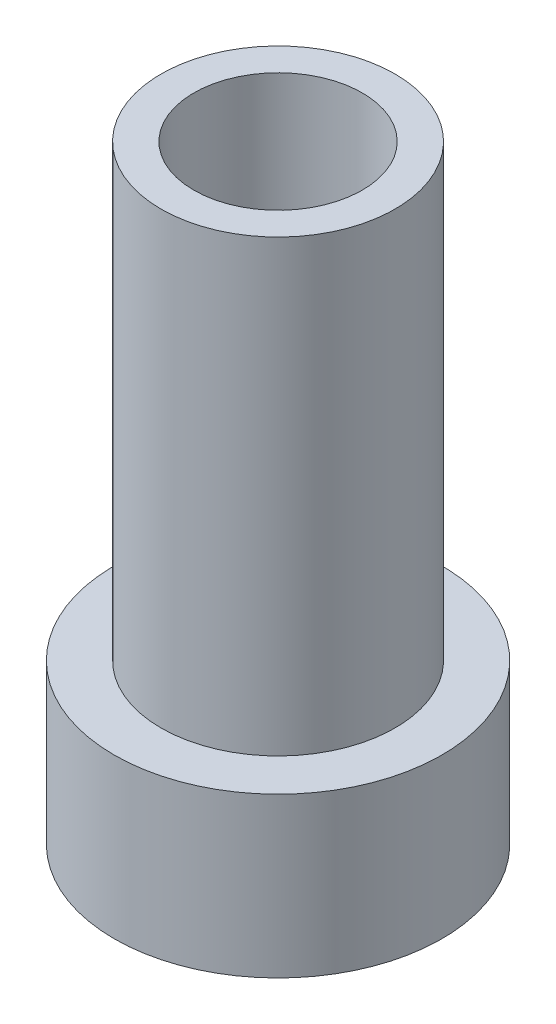
ISO-10303-21;
HEADER;
FILE_DESCRIPTION(('STEP AP214'),'2;1');
FILE_NAME('part.step','',(''),(''),'','','');
FILE_SCHEMA(('AUTOMOTIVE_DESIGN { 1 0 10303 214 1 1 1 1 }'));
ENDSEC;
DATA;
#1=APPLICATION_CONTEXT('core data for automotive mechanical design processes');
#2=APPLICATION_PROTOCOL_DEFINITION('international standard','automotive_design',2000,#1);
#3=PRODUCT_CONTEXT('',#1,'mechanical');
#4=PRODUCT('Part','Part','',(#3));
#5=PRODUCT_RELATED_PRODUCT_CATEGORY('part','',(#4));
#6=PRODUCT_DEFINITION_FORMATION('','',#4);
#7=PRODUCT_DEFINITION_CONTEXT('part definition',#1,'design');
#8=PRODUCT_DEFINITION('design','',#6,#7);
#9=PRODUCT_DEFINITION_SHAPE('','',#8);
#10=(LENGTH_UNIT() NAMED_UNIT(*) SI_UNIT(.MILLI.,.METRE.));
#11=(NAMED_UNIT(*) PLANE_ANGLE_UNIT() SI_UNIT($,.RADIAN.));
#12=(NAMED_UNIT(*) SI_UNIT($,.STERADIAN.) SOLID_ANGLE_UNIT());
#13=UNCERTAINTY_MEASURE_WITH_UNIT(LENGTH_MEASURE(1.E-05),#10,'distance_accuracy_value','');
#14=(GEOMETRIC_REPRESENTATION_CONTEXT(3) GLOBAL_UNCERTAINTY_ASSIGNED_CONTEXT((#13)) GLOBAL_UNIT_ASSIGNED_CONTEXT((#10,
#11,#12)) REPRESENTATION_CONTEXT('',''));
#15=CARTESIAN_POINT('',(0.,0.,0.));
#16=DIRECTION('',(0.,0.,1.));
#17=DIRECTION('',(1.,0.,0.));
#18=AXIS2_PLACEMENT_3D('',#15,#16,#17);
#19=CARTESIAN_POINT('',(0.,50.0001,0.));
#20=DIRECTION('',(0.,-1.,0.));
#21=DIRECTION('',(0.,0.,-1.));
#22=AXIS2_PLACEMENT_3D('',#19,#20,#21);
#23=CYLINDRICAL_SURFACE('',#22,12.5);
#24=CARTESIAN_POINT('',(0.,50.0001,0.));
#25=DIRECTION('',(0.,1.,0.));
#26=DIRECTION('',(0.,0.,1.));
#27=AXIS2_PLACEMENT_3D('',#24,#25,#26);
#28=CIRCLE('',#27,12.5);
#29=CARTESIAN_POINT('',(0.,50.0001,12.5));
#30=VERTEX_POINT('',#29);
#31=EDGE_CURVE('E13',#30,#30,#28,.T.);
#32=ORIENTED_EDGE('',*,*,#31,.F.);
#33=EDGE_LOOP('',(#32));
#34=FACE_BOUND('',#33,.T.);
#35=CARTESIAN_POINT('',(0.,2.0001,0.));
#36=DIRECTION('',(0.,1.,0.));
#37=DIRECTION('',(0.,0.,1.));
#38=AXIS2_PLACEMENT_3D('',#35,#36,#37);
#39=CIRCLE('',#38,12.5);
#40=CARTESIAN_POINT('',(0.,2.0001,12.5));
#41=VERTEX_POINT('',#40);
#42=EDGE_CURVE('E67',#41,#41,#39,.T.);
#43=ORIENTED_EDGE('',*,*,#42,.T.);
#44=EDGE_LOOP('',(#43));
#45=FACE_BOUND('',#44,.T.);
#46=ADVANCED_FACE('F64',(#34,#45),#23,.T.);
#47=CARTESIAN_POINT('',(0.,50.0001,0.));
#48=DIRECTION('',(0.,1.,0.));
#49=DIRECTION('',(0.,0.,1.));
#50=AXIS2_PLACEMENT_3D('',#47,#48,#49);
#51=PLANE('',#50);
#52=CARTESIAN_POINT('',(0.,50.0001,0.));
#53=DIRECTION('',(0.,1.,0.));
#54=DIRECTION('',(0.,0.,1.));
#55=AXIS2_PLACEMENT_3D('',#52,#53,#54);
#56=CIRCLE('',#55,9.);
#57=CARTESIAN_POINT('',(0.,50.0001,9.));
#58=VERTEX_POINT('',#57);
#59=EDGE_CURVE('E76',#58,#58,#56,.T.);
#60=ORIENTED_EDGE('',*,*,#59,.F.);
#61=EDGE_LOOP('',(#60));
#62=FACE_BOUND('',#61,.T.);
#63=ORIENTED_EDGE('',*,*,#31,.T.);
#64=EDGE_LOOP('',(#63));
#65=FACE_BOUND('',#64,.T.);
#66=ADVANCED_FACE('F89',(#62,#65),#51,.T.);
#67=CARTESIAN_POINT('',(0.,2.0001,0.));
#68=DIRECTION('',(0.,1.,0.));
#69=DIRECTION('',(0.,0.,1.));
#70=AXIS2_PLACEMENT_3D('',#67,#68,#69);
#71=PLANE('',#70);
#72=CARTESIAN_POINT('',(0.,2.0001,0.));
#73=DIRECTION('',(0.,1.,0.));
#74=DIRECTION('',(0.,0.,1.));
#75=AXIS2_PLACEMENT_3D('',#72,#73,#74);
#76=CIRCLE('',#75,9.);
#77=CARTESIAN_POINT('',(0.,2.0001,9.));
#78=VERTEX_POINT('',#77);
#79=EDGE_CURVE('E78',#78,#78,#76,.T.);
#80=ORIENTED_EDGE('',*,*,#79,.T.);
#81=EDGE_LOOP('',(#80));
#82=FACE_BOUND('',#81,.T.);
#83=ORIENTED_EDGE('',*,*,#42,.F.);
#84=EDGE_LOOP('',(#83));
#85=FACE_BOUND('',#84,.T.);
#86=ADVANCED_FACE('F91',(#82,#85),#71,.F.);
#87=CARTESIAN_POINT('',(0.,50.0001,0.));
#88=DIRECTION('',(0.,-1.,0.));
#89=DIRECTION('',(0.,0.,-1.));
#90=AXIS2_PLACEMENT_3D('',#87,#88,#89);
#91=CYLINDRICAL_SURFACE('',#90,9.);
#92=ORIENTED_EDGE('',*,*,#59,.T.);
#93=EDGE_LOOP('',(#92));
#94=FACE_BOUND('',#93,.T.);
#95=ORIENTED_EDGE('',*,*,#79,.F.);
#96=EDGE_LOOP('',(#95));
#97=FACE_BOUND('',#96,.T.);
#98=ADVANCED_FACE('F86',(#94,#97),#91,.F.);
#99=CLOSED_SHELL('',(#46,#66,#86,#98));
#100=MANIFOLD_SOLID_BREP('B2',#99);
#101=CARTESIAN_POINT('',(0.,2.0001,0.));
#102=DIRECTION('',(0.,-1.,0.));
#103=DIRECTION('',(0.,0.,-1.));
#104=AXIS2_PLACEMENT_3D('',#101,#102,#103);
#105=CYLINDRICAL_SURFACE('',#104,12.5);
#106=CARTESIAN_POINT('',(0.,-15.,0.));
#107=DIRECTION('',(0.,1.,0.));
#108=DIRECTION('',(0.,0.,1.));
#109=AXIS2_PLACEMENT_3D('',#106,#107,#108);
#110=CIRCLE('',#109,12.5);
#111=CARTESIAN_POINT('',(0.,-15.,12.5));
#112=VERTEX_POINT('',#111);
#113=EDGE_CURVE('E157',#112,#112,#110,.T.);
#114=ORIENTED_EDGE('',*,*,#113,.F.);
#115=EDGE_LOOP('',(#114));
#116=FACE_BOUND('',#115,.T.);
#117=CARTESIAN_POINT('',(0.,0.,0.));
#118=DIRECTION('',(0.,1.,0.));
#119=DIRECTION('',(0.,0.,1.));
#120=AXIS2_PLACEMENT_3D('',#117,#118,#119);
#121=CIRCLE('',#120,12.5);
#122=CARTESIAN_POINT('',(0.,0.,12.5));
#123=VERTEX_POINT('',#122);
#124=EDGE_CURVE('E151',#123,#123,#121,.T.);
#125=ORIENTED_EDGE('',*,*,#124,.T.);
#126=EDGE_LOOP('',(#125));
#127=FACE_BOUND('',#126,.T.);
#128=ADVANCED_FACE('F135',(#116,#127),#105,.F.);
#129=CARTESIAN_POINT('',(0.,2.0001,0.));
#130=DIRECTION('',(0.,1.,0.));
#131=DIRECTION('',(0.,0.,1.));
#132=AXIS2_PLACEMENT_3D('',#129,#130,#131);
#133=PLANE('',#132);
#134=CARTESIAN_POINT('',(0.,2.0001,0.));
#135=DIRECTION('',(0.,1.,0.));
#136=DIRECTION('',(0.,0.,1.));
#137=AXIS2_PLACEMENT_3D('',#134,#135,#136);
#138=CIRCLE('',#137,17.5);
#139=CARTESIAN_POINT('',(0.,2.0001,17.5));
#140=VERTEX_POINT('',#139);
#141=EDGE_CURVE('E63',#140,#140,#138,.T.);
#142=ORIENTED_EDGE('',*,*,#141,.T.);
#143=EDGE_LOOP('',(#142));
#144=FACE_BOUND('',#143,.T.);
#145=CARTESIAN_POINT('',(0.,2.0001,0.));
#146=DIRECTION('',(0.,1.,0.));
#147=DIRECTION('',(0.,0.,1.));
#148=AXIS2_PLACEMENT_3D('',#145,#146,#147);
#149=CIRCLE('',#148,12.5);
#150=CARTESIAN_POINT('',(0.,2.0001,12.5));
#151=VERTEX_POINT('',#150);
#152=EDGE_CURVE('E143',#151,#151,#149,.T.);
#153=ORIENTED_EDGE('',*,*,#152,.F.);
#154=EDGE_LOOP('',(#153));
#155=FACE_BOUND('',#154,.T.);
#156=ADVANCED_FACE('F187',(#144,#155),#133,.T.);
#157=CARTESIAN_POINT('',(0.,2.0001,0.));
#158=DIRECTION('',(0.,-1.,0.));
#159=DIRECTION('',(0.,0.,-1.));
#160=AXIS2_PLACEMENT_3D('',#157,#158,#159);
#161=CYLINDRICAL_SURFACE('',#160,17.5);
#162=ORIENTED_EDGE('',*,*,#141,.F.);
#163=EDGE_LOOP('',(#162));
#164=FACE_BOUND('',#163,.T.);
#165=CARTESIAN_POINT('',(0.,-15.,0.));
#166=DIRECTION('',(0.,1.,0.));
#167=DIRECTION('',(0.,0.,1.));
#168=AXIS2_PLACEMENT_3D('',#165,#166,#167);
#169=CIRCLE('',#168,17.5);
#170=CARTESIAN_POINT('',(0.,-15.,17.5));
#171=VERTEX_POINT('',#170);
#172=EDGE_CURVE('E148',#171,#171,#169,.T.);
#173=ORIENTED_EDGE('',*,*,#172,.T.);
#174=EDGE_LOOP('',(#173));
#175=FACE_BOUND('',#174,.T.);
#176=ADVANCED_FACE('F137',(#164,#175),#161,.T.);
#177=CARTESIAN_POINT('',(0.,2.,0.));
#178=DIRECTION('',(0.,1.,0.));
#179=DIRECTION('',(0.,0.,1.));
#180=AXIS2_PLACEMENT_3D('',#177,#178,#179);
#181=CIRCLE('',#180,12.5);
#182=CARTESIAN_POINT('',(0.,2.,12.5));
#183=VERTEX_POINT('',#182);
#184=EDGE_CURVE('E139',#183,#183,#181,.T.);
#185=ORIENTED_EDGE('',*,*,#184,.F.);
#186=EDGE_LOOP('',(#185));
#187=FACE_BOUND('',#186,.T.);
#188=ORIENTED_EDGE('',*,*,#152,.T.);
#189=EDGE_LOOP('',(#188));
#190=FACE_BOUND('',#189,.T.);
#191=ADVANCED_FACE('F174',(#187,#190),#105,.F.);
#192=CARTESIAN_POINT('',(0.,-15.,0.));
#193=DIRECTION('',(0.,1.,0.));
#194=DIRECTION('',(0.,0.,1.));
#195=AXIS2_PLACEMENT_3D('',#192,#193,#194);
#196=PLANE('',#195);
#197=ORIENTED_EDGE('',*,*,#113,.T.);
#198=EDGE_LOOP('',(#197));
#199=FACE_BOUND('',#198,.T.);
#200=ORIENTED_EDGE('',*,*,#172,.F.);
#201=EDGE_LOOP('',(#200));
#202=FACE_BOUND('',#201,.T.);
#203=ADVANCED_FACE('F171',(#199,#202),#196,.F.);
#204=CARTESIAN_POINT('',(0.,2.,0.));
#205=DIRECTION('',(0.,-1.,0.));
#206=DIRECTION('',(0.,0.,-1.));
#207=AXIS2_PLACEMENT_3D('',#204,#205,#206);
#208=CYLINDRICAL_SURFACE('',#207,15.);
#209=CARTESIAN_POINT('',(0.,2.,0.));
#210=DIRECTION('',(0.,1.,0.));
#211=DIRECTION('',(0.,0.,1.));
#212=AXIS2_PLACEMENT_3D('',#209,#210,#211);
#213=CIRCLE('',#212,15.);
#214=CARTESIAN_POINT('',(0.,2.,15.));
#215=VERTEX_POINT('',#214);
#216=EDGE_CURVE('E153',#215,#215,#213,.T.);
#217=ORIENTED_EDGE('',*,*,#216,.T.);
#218=EDGE_LOOP('',(#217));
#219=FACE_BOUND('',#218,.T.);
#220=CARTESIAN_POINT('',(0.,0.,0.));
#221=DIRECTION('',(0.,1.,0.));
#222=DIRECTION('',(0.,0.,1.));
#223=AXIS2_PLACEMENT_3D('',#220,#221,#222);
#224=CIRCLE('',#223,15.);
#225=CARTESIAN_POINT('',(0.,0.,15.));
#226=VERTEX_POINT('',#225);
#227=EDGE_CURVE('E159',#226,#226,#224,.T.);
#228=ORIENTED_EDGE('',*,*,#227,.F.);
#229=EDGE_LOOP('',(#228));
#230=FACE_BOUND('',#229,.T.);
#231=ADVANCED_FACE('F173',(#219,#230),#208,.F.);
#232=CARTESIAN_POINT('',(0.,2.,0.));
#233=DIRECTION('',(0.,1.,0.));
#234=DIRECTION('',(0.,0.,1.));
#235=AXIS2_PLACEMENT_3D('',#232,#233,#234);
#236=PLANE('',#235);
#237=ORIENTED_EDGE('',*,*,#184,.T.);
#238=EDGE_LOOP('',(#237));
#239=FACE_BOUND('',#238,.T.);
#240=ORIENTED_EDGE('',*,*,#216,.F.);
#241=EDGE_LOOP('',(#240));
#242=FACE_BOUND('',#241,.T.);
#243=ADVANCED_FACE('F182',(#239,#242),#236,.F.);
#244=CARTESIAN_POINT('',(0.,0.,0.));
#245=DIRECTION('',(0.,1.,0.));
#246=DIRECTION('',(0.,0.,1.));
#247=AXIS2_PLACEMENT_3D('',#244,#245,#246);
#248=PLANE('',#247);
#249=ORIENTED_EDGE('',*,*,#124,.F.);
#250=EDGE_LOOP('',(#249));
#251=FACE_BOUND('',#250,.T.);
#252=ORIENTED_EDGE('',*,*,#227,.T.);
#253=EDGE_LOOP('',(#252));
#254=FACE_BOUND('',#253,.T.);
#255=ADVANCED_FACE('F234',(#251,#254),#248,.T.);
#256=CLOSED_SHELL('',(#128,#156,#176,#191,#203,#231,#243,#255));
#257=MANIFOLD_SOLID_BREP('B8',#256);
#258=ADVANCED_BREP_SHAPE_REPRESENTATION('',(#18,#100,#257),#14);
#259=SHAPE_DEFINITION_REPRESENTATION(#9,#258);
ENDSEC;
END-ISO-10303-21;
